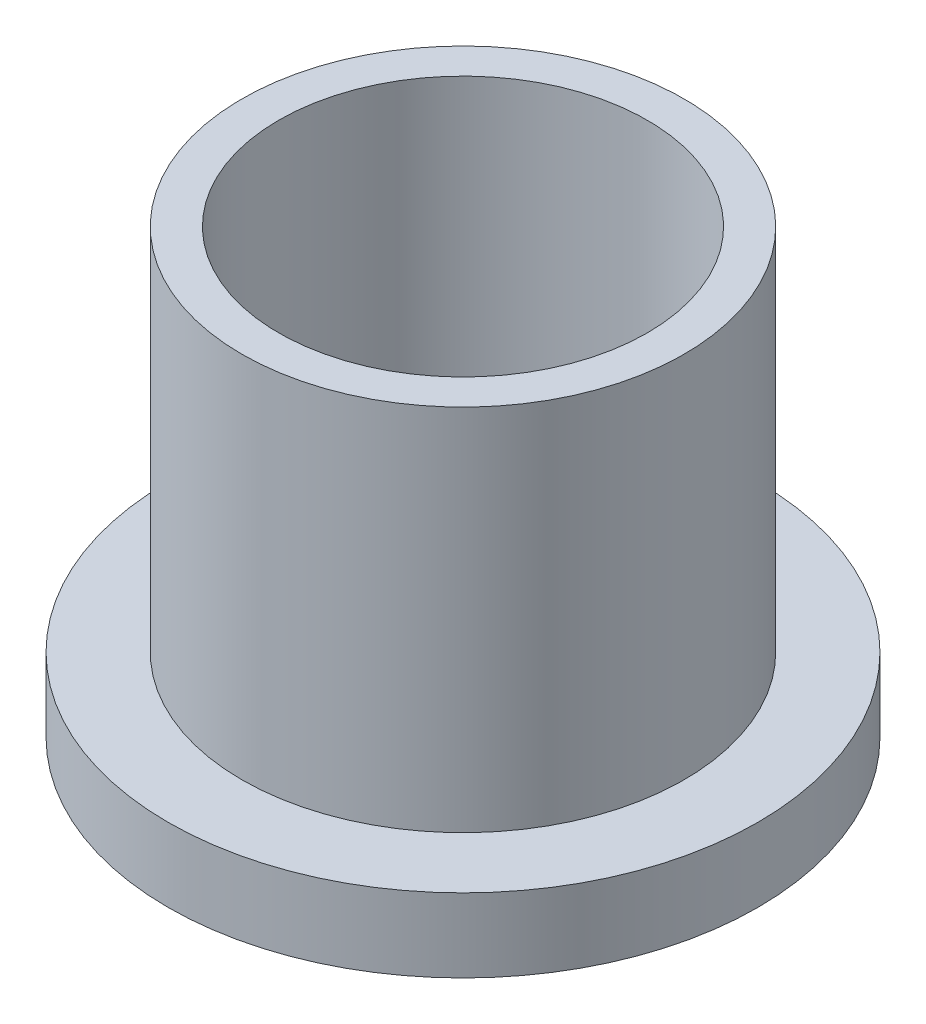
ISO-10303-21;
HEADER;
FILE_DESCRIPTION(('STEP AP214'),'2;1');
FILE_NAME('part.step','',(''),(''),'','','');
FILE_SCHEMA(('AUTOMOTIVE_DESIGN { 1 0 10303 214 1 1 1 1 }'));
ENDSEC;
DATA;
#1=APPLICATION_CONTEXT('core data for automotive mechanical design processes');
#2=APPLICATION_PROTOCOL_DEFINITION('international standard','automotive_design',2000,#1);
#3=PRODUCT_CONTEXT('',#1,'mechanical');
#4=PRODUCT('Part','Part','',(#3));
#5=PRODUCT_RELATED_PRODUCT_CATEGORY('part','',(#4));
#6=PRODUCT_DEFINITION_FORMATION('','',#4);
#7=PRODUCT_DEFINITION_CONTEXT('part definition',#1,'design');
#8=PRODUCT_DEFINITION('design','',#6,#7);
#9=PRODUCT_DEFINITION_SHAPE('','',#8);
#10=(LENGTH_UNIT() NAMED_UNIT(*) SI_UNIT(.MILLI.,.METRE.));
#11=(NAMED_UNIT(*) PLANE_ANGLE_UNIT() SI_UNIT($,.RADIAN.));
#12=(NAMED_UNIT(*) SI_UNIT($,.STERADIAN.) SOLID_ANGLE_UNIT());
#13=UNCERTAINTY_MEASURE_WITH_UNIT(LENGTH_MEASURE(1.E-05),#10,'distance_accuracy_value','');
#14=(GEOMETRIC_REPRESENTATION_CONTEXT(3) GLOBAL_UNCERTAINTY_ASSIGNED_CONTEXT((#13)) GLOBAL_UNIT_ASSIGNED_CONTEXT((#10,
#11,#12)) REPRESENTATION_CONTEXT('',''));
#15=CARTESIAN_POINT('',(0.,0.,0.));
#16=DIRECTION('',(0.,0.,1.));
#17=DIRECTION('',(1.,0.,0.));
#18=AXIS2_PLACEMENT_3D('',#15,#16,#17);
#19=CARTESIAN_POINT('',(0.,10.,0.));
#20=DIRECTION('',(0.,1.,0.));
#21=DIRECTION('',(0.,0.,1.));
#22=AXIS2_PLACEMENT_3D('',#19,#20,#21);
#23=PLANE('',#22);
#24=CARTESIAN_POINT('',(0.,10.,0.));
#25=DIRECTION('',(0.,1.,0.));
#26=DIRECTION('',(0.,0.,1.));
#27=AXIS2_PLACEMENT_3D('',#24,#25,#26);
#28=CIRCLE('',#27,6.);
#29=CARTESIAN_POINT('',(0.,10.,6.));
#30=VERTEX_POINT('',#29);
#31=EDGE_CURVE('E11',#30,#30,#28,.T.);
#32=ORIENTED_EDGE('',*,*,#31,.T.);
#33=EDGE_LOOP('',(#32));
#34=FACE_BOUND('',#33,.T.);
#35=CARTESIAN_POINT('',(0.,10.,0.));
#36=DIRECTION('',(0.,1.,0.));
#37=DIRECTION('',(1.,0.,0.));
#38=AXIS2_PLACEMENT_3D('',#35,#36,#37);
#39=CIRCLE('',#38,5.);
#40=CARTESIAN_POINT('',(5.,10.,0.));
#41=VERTEX_POINT('',#40);
#42=EDGE_CURVE('E52',#41,#41,#39,.T.);
#43=ORIENTED_EDGE('',*,*,#42,.F.);
#44=EDGE_LOOP('',(#43));
#45=FACE_BOUND('',#44,.T.);
#46=ADVANCED_FACE('F43',(#34,#45),#23,.T.);
#47=CARTESIAN_POINT('',(0.,10.,0.));
#48=DIRECTION('',(0.,-1.,0.));
#49=DIRECTION('',(0.,0.,-1.));
#50=AXIS2_PLACEMENT_3D('',#47,#48,#49);
#51=CYLINDRICAL_SURFACE('',#50,6.);
#52=ORIENTED_EDGE('',*,*,#31,.F.);
#53=EDGE_LOOP('',(#52));
#54=FACE_BOUND('',#53,.T.);
#55=CARTESIAN_POINT('',(0.,0.,0.));
#56=DIRECTION('',(0.,1.,0.));
#57=DIRECTION('',(0.,0.,1.));
#58=AXIS2_PLACEMENT_3D('',#55,#56,#57);
#59=CIRCLE('',#58,6.);
#60=CARTESIAN_POINT('',(0.,0.,6.));
#61=VERTEX_POINT('',#60);
#62=EDGE_CURVE('E47',#61,#61,#59,.T.);
#63=ORIENTED_EDGE('',*,*,#62,.T.);
#64=EDGE_LOOP('',(#63));
#65=FACE_BOUND('',#64,.T.);
#66=ADVANCED_FACE('F45',(#54,#65),#51,.T.);
#67=CARTESIAN_POINT('',(0.,10.,0.));
#68=DIRECTION('',(0.,-1.,0.));
#69=DIRECTION('',(0.,0.,-1.));
#70=AXIS2_PLACEMENT_3D('',#67,#68,#69);
#71=CYLINDRICAL_SURFACE('',#70,5.);
#72=ORIENTED_EDGE('',*,*,#42,.T.);
#73=EDGE_LOOP('',(#72));
#74=FACE_BOUND('',#73,.T.);
#75=CARTESIAN_POINT('',(0.,0.,0.));
#76=DIRECTION('',(0.,1.,0.));
#77=DIRECTION('',(1.,0.,0.));
#78=AXIS2_PLACEMENT_3D('',#75,#76,#77);
#79=CIRCLE('',#78,5.);
#80=CARTESIAN_POINT('',(5.,0.,0.));
#81=VERTEX_POINT('',#80);
#82=EDGE_CURVE('E57',#81,#81,#79,.T.);
#83=ORIENTED_EDGE('',*,*,#82,.F.);
#84=EDGE_LOOP('',(#83));
#85=FACE_BOUND('',#84,.T.);
#86=ADVANCED_FACE('F94',(#74,#85),#71,.F.);
#87=CARTESIAN_POINT('',(0.,0.,0.));
#88=DIRECTION('',(0.,-1.,0.));
#89=DIRECTION('',(0.,0.,-1.));
#90=AXIS2_PLACEMENT_3D('',#87,#88,#89);
#91=PLANE('',#90);
#92=ORIENTED_EDGE('',*,*,#82,.T.);
#93=EDGE_LOOP('',(#92));
#94=FACE_BOUND('',#93,.T.);
#95=ADVANCED_FACE('F82',(#94),#91,.F.);
#96=CARTESIAN_POINT('',(0.,-2.,0.));
#97=DIRECTION('',(0.,1.,0.));
#98=DIRECTION('',(0.,0.,1.));
#99=AXIS2_PLACEMENT_3D('',#96,#97,#98);
#100=CYLINDRICAL_SURFACE('',#99,8.);
#101=CARTESIAN_POINT('',(0.,-2.,0.));
#102=DIRECTION('',(0.,-1.,0.));
#103=DIRECTION('',(0.,0.,-1.));
#104=AXIS2_PLACEMENT_3D('',#101,#102,#103);
#105=CIRCLE('',#104,8.);
#106=CARTESIAN_POINT('',(0.,-2.,-8.));
#107=VERTEX_POINT('',#106);
#108=EDGE_CURVE('E67',#107,#107,#105,.T.);
#109=ORIENTED_EDGE('',*,*,#108,.F.);
#110=EDGE_LOOP('',(#109));
#111=FACE_BOUND('',#110,.T.);
#112=CARTESIAN_POINT('',(0.,0.,0.));
#113=DIRECTION('',(0.,-1.,0.));
#114=DIRECTION('',(0.,0.,-1.));
#115=AXIS2_PLACEMENT_3D('',#112,#113,#114);
#116=CIRCLE('',#115,8.);
#117=CARTESIAN_POINT('',(0.,0.,-8.));
#118=VERTEX_POINT('',#117);
#119=EDGE_CURVE('E63',#118,#118,#116,.T.);
#120=ORIENTED_EDGE('',*,*,#119,.T.);
#121=EDGE_LOOP('',(#120));
#122=FACE_BOUND('',#121,.T.);
#123=ADVANCED_FACE('F85',(#111,#122),#100,.T.);
#124=CARTESIAN_POINT('',(0.,-2.,0.));
#125=DIRECTION('',(0.,-1.,0.));
#126=DIRECTION('',(0.,0.,-1.));
#127=AXIS2_PLACEMENT_3D('',#124,#125,#126);
#128=PLANE('',#127);
#129=ORIENTED_EDGE('',*,*,#108,.T.);
#130=EDGE_LOOP('',(#129));
#131=FACE_BOUND('',#130,.T.);
#132=ADVANCED_FACE('F80',(#131),#128,.T.);
#133=ORIENTED_EDGE('',*,*,#62,.F.);
#134=EDGE_LOOP('',(#133));
#135=FACE_BOUND('',#134,.T.);
#136=ORIENTED_EDGE('',*,*,#119,.F.);
#137=EDGE_LOOP('',(#136));
#138=FACE_BOUND('',#137,.T.);
#139=ADVANCED_FACE('F77',(#135,#138),#91,.F.);
#140=CLOSED_SHELL('',(#46,#66,#86,#95,#123,#132,#139));
#141=MANIFOLD_SOLID_BREP('B2',#140);
#142=ADVANCED_BREP_SHAPE_REPRESENTATION('',(#18,#141),#14);
#143=SHAPE_DEFINITION_REPRESENTATION(#9,#142);
ENDSEC;
END-ISO-10303-21;
